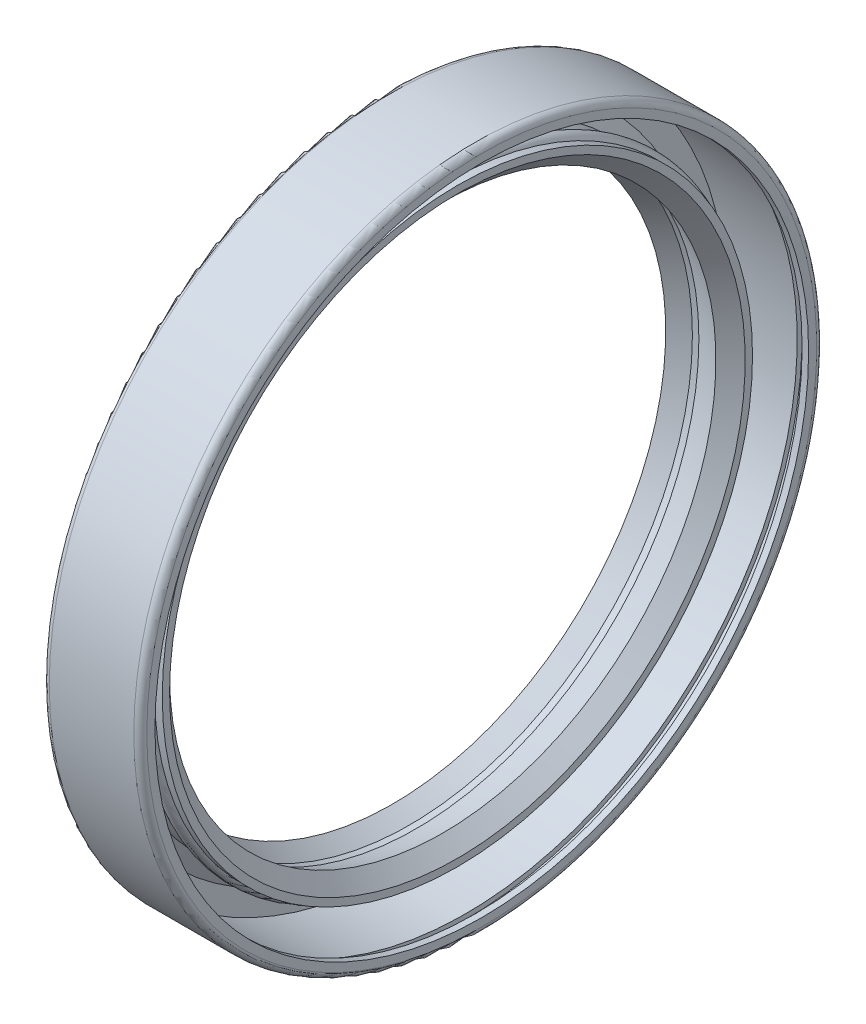
ISO-10303-21;
HEADER;
FILE_DESCRIPTION(('STEP AP214'),'2;1');
FILE_NAME('part.step','',(''),(''),'','','');
FILE_SCHEMA(('AUTOMOTIVE_DESIGN { 1 0 10303 214 1 1 1 1 }'));
ENDSEC;
DATA;
#1=APPLICATION_CONTEXT('core data for automotive mechanical design processes');
#2=APPLICATION_PROTOCOL_DEFINITION('international standard','automotive_design',2000,#1);
#3=PRODUCT_CONTEXT('',#1,'mechanical');
#4=PRODUCT('Part','Part','',(#3));
#5=PRODUCT_RELATED_PRODUCT_CATEGORY('part','',(#4));
#6=PRODUCT_DEFINITION_FORMATION('','',#4);
#7=PRODUCT_DEFINITION_CONTEXT('part definition',#1,'design');
#8=PRODUCT_DEFINITION('design','',#6,#7);
#9=PRODUCT_DEFINITION_SHAPE('','',#8);
#10=(LENGTH_UNIT() NAMED_UNIT(*) SI_UNIT(.MILLI.,.METRE.));
#11=(NAMED_UNIT(*) PLANE_ANGLE_UNIT() SI_UNIT($,.RADIAN.));
#12=(NAMED_UNIT(*) SI_UNIT($,.STERADIAN.) SOLID_ANGLE_UNIT());
#13=UNCERTAINTY_MEASURE_WITH_UNIT(LENGTH_MEASURE(1.E-05),#10,'distance_accuracy_value','');
#14=(GEOMETRIC_REPRESENTATION_CONTEXT(3) GLOBAL_UNCERTAINTY_ASSIGNED_CONTEXT((#13)) GLOBAL_UNIT_ASSIGNED_CONTEXT((#10,
#11,#12)) REPRESENTATION_CONTEXT('',''));
#15=CARTESIAN_POINT('',(0.,0.,0.));
#16=DIRECTION('',(0.,0.,1.));
#17=DIRECTION('',(1.,0.,0.));
#18=AXIS2_PLACEMENT_3D('',#15,#16,#17);
#19=CARTESIAN_POINT('',(0.,0.,0.));
#20=DIRECTION('',(-1.,0.,0.));
#21=DIRECTION('',(0.,0.,1.));
#22=AXIS2_PLACEMENT_3D('',#19,#20,#21);
#23=CONICAL_SURFACE('',#22,15.6830127018922,1.04719755119659);
#24=CARTESIAN_POINT('',(0.250000000000002,0.,0.));
#25=DIRECTION('',(-1.,0.,0.));
#26=DIRECTION('',(0.,0.,1.));
#27=AXIS2_PLACEMENT_3D('',#24,#25,#26);
#28=CIRCLE('',#27,15.25);
#29=CARTESIAN_POINT('',(0.250000000000002,0.,15.25));
#30=VERTEX_POINT('',#29);
#31=EDGE_CURVE('E10',#30,#30,#28,.T.);
#32=ORIENTED_EDGE('',*,*,#31,.F.);
#33=EDGE_LOOP('',(#32));
#34=FACE_BOUND('',#33,.T.);
#35=CARTESIAN_POINT('',(0.,0.,0.));
#36=DIRECTION('',(-1.,0.,0.));
#37=DIRECTION('',(0.,0.,1.));
#38=AXIS2_PLACEMENT_3D('',#35,#36,#37);
#39=CIRCLE('',#38,15.6830127018922);
#40=CARTESIAN_POINT('',(0.,0.,15.6830127018922));
#41=VERTEX_POINT('',#40);
#42=EDGE_CURVE('E117',#41,#41,#39,.T.);
#43=ORIENTED_EDGE('',*,*,#42,.T.);
#44=EDGE_LOOP('',(#43));
#45=FACE_BOUND('',#44,.T.);
#46=ADVANCED_FACE('F32',(#34,#45),#23,.F.);
#47=CARTESIAN_POINT('',(0.,0.,0.));
#48=DIRECTION('',(-1.,0.,0.));
#49=DIRECTION('',(0.,0.,1.));
#50=AXIS2_PLACEMENT_3D('',#47,#48,#49);
#51=CYLINDRICAL_SURFACE('',#50,15.25);
#52=CARTESIAN_POINT('',(0.,0.,0.));
#53=DIRECTION('',(-1.,0.,0.));
#54=DIRECTION('',(0.,0.,1.));
#55=AXIS2_PLACEMENT_3D('',#52,#53,#54);
#56=CIRCLE('',#55,15.25);
#57=CARTESIAN_POINT('',(0.,0.,15.25));
#58=VERTEX_POINT('',#57);
#59=EDGE_CURVE('E38',#58,#58,#56,.T.);
#60=ORIENTED_EDGE('',*,*,#59,.F.);
#61=EDGE_LOOP('',(#60));
#62=FACE_BOUND('',#61,.T.);
#63=ORIENTED_EDGE('',*,*,#31,.T.);
#64=EDGE_LOOP('',(#63));
#65=FACE_BOUND('',#64,.T.);
#66=ADVANCED_FACE('F268',(#62,#65),#51,.T.);
#67=CARTESIAN_POINT('',(0.,0.,-15.25));
#68=DIRECTION('',(1.,0.,0.));
#69=DIRECTION('',(0.,0.,-1.));
#70=AXIS2_PLACEMENT_3D('',#67,#68,#69);
#71=PLANE('',#70);
#72=CARTESIAN_POINT('',(0.,0.,0.));
#73=DIRECTION('',(-1.,0.,0.));
#74=DIRECTION('',(0.,0.,1.));
#75=AXIS2_PLACEMENT_3D('',#72,#73,#74);
#76=CIRCLE('',#75,14.8333333333333);
#77=CARTESIAN_POINT('',(0.,0.,14.8333333333333));
#78=VERTEX_POINT('',#77);
#79=EDGE_CURVE('E42',#78,#78,#76,.T.);
#80=ORIENTED_EDGE('',*,*,#79,.F.);
#81=EDGE_LOOP('',(#80));
#82=FACE_BOUND('',#81,.T.);
#83=ORIENTED_EDGE('',*,*,#59,.T.);
#84=EDGE_LOOP('',(#83));
#85=FACE_BOUND('',#84,.T.);
#86=ADVANCED_FACE('F263',(#82,#85),#71,.F.);
#87=CARTESIAN_POINT('',(0.333333333333335,0.,0.));
#88=DIRECTION('',(-1.,0.,0.));
#89=DIRECTION('',(0.,0.,1.));
#90=AXIS2_PLACEMENT_3D('',#87,#88,#89);
#91=TOROIDAL_SURFACE('',#90,14.8333333333333,0.333333333333333);
#92=CARTESIAN_POINT('',(0.333333333333335,0.,0.));
#93=DIRECTION('',(-1.,0.,0.));
#94=DIRECTION('',(0.,0.,1.));
#95=AXIS2_PLACEMENT_3D('',#92,#93,#94);
#96=CIRCLE('',#95,14.5);
#97=CARTESIAN_POINT('',(0.333333333333335,0.,14.5));
#98=VERTEX_POINT('',#97);
#99=EDGE_CURVE('E46',#98,#98,#96,.T.);
#100=ORIENTED_EDGE('',*,*,#99,.F.);
#101=EDGE_LOOP('',(#100));
#102=FACE_BOUND('',#101,.T.);
#103=ORIENTED_EDGE('',*,*,#79,.T.);
#104=EDGE_LOOP('',(#103));
#105=FACE_BOUND('',#104,.T.);
#106=ADVANCED_FACE('F257',(#102,#105),#91,.T.);
#107=CARTESIAN_POINT('',(0.,0.,0.));
#108=DIRECTION('',(-1.,0.,0.));
#109=DIRECTION('',(0.,0.,1.));
#110=AXIS2_PLACEMENT_3D('',#107,#108,#109);
#111=CYLINDRICAL_SURFACE('',#110,14.5);
#112=CARTESIAN_POINT('',(0.583333333333335,0.,0.));
#113=DIRECTION('',(-1.,0.,0.));
#114=DIRECTION('',(0.,0.,1.));
#115=AXIS2_PLACEMENT_3D('',#112,#113,#114);
#116=CIRCLE('',#115,14.5);
#117=CARTESIAN_POINT('',(0.583333333333335,0.,14.5));
#118=VERTEX_POINT('',#117);
#119=EDGE_CURVE('E51',#118,#118,#116,.T.);
#120=ORIENTED_EDGE('',*,*,#119,.F.);
#121=EDGE_LOOP('',(#120));
#122=FACE_BOUND('',#121,.T.);
#123=ORIENTED_EDGE('',*,*,#99,.T.);
#124=EDGE_LOOP('',(#123));
#125=FACE_BOUND('',#124,.T.);
#126=ADVANCED_FACE('F251',(#122,#125),#111,.F.);
#127=CARTESIAN_POINT('',(0.583333333333335,0.,0.));
#128=DIRECTION('',(1.,0.,0.));
#129=DIRECTION('',(0.,0.,-1.));
#130=AXIS2_PLACEMENT_3D('',#127,#128,#129);
#131=CONICAL_SURFACE('',#130,14.5,0.523598775598295);
#132=CARTESIAN_POINT('',(0.250000000000002,0.,0.));
#133=DIRECTION('',(-1.,0.,0.));
#134=DIRECTION('',(0.,0.,1.));
#135=AXIS2_PLACEMENT_3D('',#132,#133,#134);
#136=CIRCLE('',#135,14.3075499102701);
#137=CARTESIAN_POINT('',(0.250000000000002,0.,14.3075499102701));
#138=VERTEX_POINT('',#137);
#139=EDGE_CURVE('E54',#138,#138,#136,.T.);
#140=ORIENTED_EDGE('',*,*,#139,.F.);
#141=EDGE_LOOP('',(#140));
#142=FACE_BOUND('',#141,.T.);
#143=ORIENTED_EDGE('',*,*,#119,.T.);
#144=EDGE_LOOP('',(#143));
#145=FACE_BOUND('',#144,.T.);
#146=ADVANCED_FACE('F245',(#142,#145),#131,.T.);
#147=CARTESIAN_POINT('',(0.250000000000002,0.,0.));
#148=DIRECTION('',(-1.,0.,0.));
#149=DIRECTION('',(0.,0.,1.));
#150=AXIS2_PLACEMENT_3D('',#147,#148,#149);
#151=CONICAL_SURFACE('',#150,14.3075499102701,1.0471975511966);
#152=CARTESIAN_POINT('',(0.427564023483705,0.,0.));
#153=DIRECTION('',(-1.,0.,0.));
#154=DIRECTION('',(0.,0.,1.));
#155=AXIS2_PLACEMENT_3D('',#152,#153,#154);
#156=CIRCLE('',#155,14.);
#157=CARTESIAN_POINT('',(0.427564023483705,0.,14.));
#158=VERTEX_POINT('',#157);
#159=EDGE_CURVE('E57',#158,#158,#156,.T.);
#160=ORIENTED_EDGE('',*,*,#159,.F.);
#161=EDGE_LOOP('',(#160));
#162=FACE_BOUND('',#161,.T.);
#163=ORIENTED_EDGE('',*,*,#139,.T.);
#164=EDGE_LOOP('',(#163));
#165=FACE_BOUND('',#164,.T.);
#166=ADVANCED_FACE('F239',(#162,#165),#151,.F.);
#167=CARTESIAN_POINT('',(0.427564023483705,0.,0.));
#168=DIRECTION('',(1.,0.,0.));
#169=DIRECTION('',(0.,0.,-1.));
#170=AXIS2_PLACEMENT_3D('',#167,#168,#169);
#171=CONICAL_SURFACE('',#170,14.,0.523598775598299);
#172=CARTESIAN_POINT('',(1.29358942726814,0.,0.));
#173=DIRECTION('',(-1.,0.,0.));
#174=DIRECTION('',(0.,0.,1.));
#175=AXIS2_PLACEMENT_3D('',#172,#173,#174);
#176=CIRCLE('',#175,14.5);
#177=CARTESIAN_POINT('',(1.29358942726814,0.,14.5));
#178=VERTEX_POINT('',#177);
#179=EDGE_CURVE('E60',#178,#178,#176,.T.);
#180=ORIENTED_EDGE('',*,*,#179,.F.);
#181=EDGE_LOOP('',(#180));
#182=FACE_BOUND('',#181,.T.);
#183=ORIENTED_EDGE('',*,*,#159,.T.);
#184=EDGE_LOOP('',(#183));
#185=FACE_BOUND('',#184,.T.);
#186=ADVANCED_FACE('F233',(#182,#185),#171,.F.);
#187=CARTESIAN_POINT('',(0.,0.,0.));
#188=DIRECTION('',(-1.,0.,0.));
#189=DIRECTION('',(0.,0.,1.));
#190=AXIS2_PLACEMENT_3D('',#187,#188,#189);
#191=CYLINDRICAL_SURFACE('',#190,14.5);
#192=CARTESIAN_POINT('',(1.6262612902727,0.,0.));
#193=DIRECTION('',(-1.,0.,0.));
#194=DIRECTION('',(0.,0.,1.));
#195=AXIS2_PLACEMENT_3D('',#192,#193,#194);
#196=CIRCLE('',#195,14.5);
#197=CARTESIAN_POINT('',(1.6262612902727,0.,14.5));
#198=VERTEX_POINT('',#197);
#199=EDGE_CURVE('E63',#198,#198,#196,.T.);
#200=ORIENTED_EDGE('',*,*,#199,.F.);
#201=EDGE_LOOP('',(#200));
#202=FACE_BOUND('',#201,.T.);
#203=ORIENTED_EDGE('',*,*,#179,.T.);
#204=EDGE_LOOP('',(#203));
#205=FACE_BOUND('',#204,.T.);
#206=ADVANCED_FACE('F227',(#202,#205),#191,.F.);
#207=CARTESIAN_POINT('',(1.6262612902727,0.,0.));
#208=DIRECTION('',(-1.,0.,0.));
#209=DIRECTION('',(0.,0.,1.));
#210=AXIS2_PLACEMENT_3D('',#207,#208,#209);
#211=CONICAL_SURFACE('',#210,14.5,0.349065850398867);
#212=CARTESIAN_POINT('',(3.,0.,0.));
#213=DIRECTION('',(-1.,0.,0.));
#214=DIRECTION('',(0.,0.,1.));
#215=AXIS2_PLACEMENT_3D('',#212,#213,#214);
#216=CIRCLE('',#215,14.);
#217=CARTESIAN_POINT('',(3.,0.,14.));
#218=VERTEX_POINT('',#217);
#219=EDGE_CURVE('E66',#218,#218,#216,.T.);
#220=ORIENTED_EDGE('',*,*,#219,.F.);
#221=EDGE_LOOP('',(#220));
#222=FACE_BOUND('',#221,.T.);
#223=ORIENTED_EDGE('',*,*,#199,.T.);
#224=EDGE_LOOP('',(#223));
#225=FACE_BOUND('',#224,.T.);
#226=ADVANCED_FACE('F221',(#222,#225),#211,.F.);
#227=CARTESIAN_POINT('',(3.,0.,0.));
#228=DIRECTION('',(1.,0.,0.));
#229=DIRECTION('',(0.,0.,-1.));
#230=AXIS2_PLACEMENT_3D('',#227,#228,#229);
#231=CONICAL_SURFACE('',#230,14.,0.78539816339745);
#232=CARTESIAN_POINT('',(3.75,0.,0.));
#233=DIRECTION('',(-1.,0.,0.));
#234=DIRECTION('',(0.,0.,1.));
#235=AXIS2_PLACEMENT_3D('',#232,#233,#234);
#236=CIRCLE('',#235,14.75);
#237=CARTESIAN_POINT('',(3.75,0.,14.75));
#238=VERTEX_POINT('',#237);
#239=EDGE_CURVE('E69',#238,#238,#236,.T.);
#240=ORIENTED_EDGE('',*,*,#239,.F.);
#241=EDGE_LOOP('',(#240));
#242=FACE_BOUND('',#241,.T.);
#243=ORIENTED_EDGE('',*,*,#219,.T.);
#244=EDGE_LOOP('',(#243));
#245=FACE_BOUND('',#244,.T.);
#246=ADVANCED_FACE('F215',(#242,#245),#231,.F.);
#247=CARTESIAN_POINT('',(3.75,0.,-14.75));
#248=DIRECTION('',(-1.,0.,0.));
#249=DIRECTION('',(0.,0.,1.));
#250=AXIS2_PLACEMENT_3D('',#247,#248,#249);
#251=PLANE('',#250);
#252=CARTESIAN_POINT('',(3.75,0.,0.));
#253=DIRECTION('',(-1.,0.,0.));
#254=DIRECTION('',(0.,0.,1.));
#255=AXIS2_PLACEMENT_3D('',#252,#253,#254);
#256=CIRCLE('',#255,15.125);
#257=CARTESIAN_POINT('',(3.75,0.,15.125));
#258=VERTEX_POINT('',#257);
#259=EDGE_CURVE('E72',#258,#258,#256,.T.);
#260=ORIENTED_EDGE('',*,*,#259,.F.);
#261=EDGE_LOOP('',(#260));
#262=FACE_BOUND('',#261,.T.);
#263=ORIENTED_EDGE('',*,*,#239,.T.);
#264=EDGE_LOOP('',(#263));
#265=FACE_BOUND('',#264,.T.);
#266=ADVANCED_FACE('F209',(#262,#265),#251,.F.);
#267=CARTESIAN_POINT('',(0.,0.,0.));
#268=DIRECTION('',(-1.,0.,0.));
#269=DIRECTION('',(0.,0.,1.));
#270=AXIS2_PLACEMENT_3D('',#267,#268,#269);
#271=CYLINDRICAL_SURFACE('',#270,15.125);
#272=CARTESIAN_POINT('',(3.35355339059328,0.,0.));
#273=DIRECTION('',(-1.,0.,0.));
#274=DIRECTION('',(0.,0.,1.));
#275=AXIS2_PLACEMENT_3D('',#272,#273,#274);
#276=CIRCLE('',#275,15.125);
#277=CARTESIAN_POINT('',(3.35355339059328,0.,15.125));
#278=VERTEX_POINT('',#277);
#279=EDGE_CURVE('E75',#278,#278,#276,.T.);
#280=ORIENTED_EDGE('',*,*,#279,.F.);
#281=EDGE_LOOP('',(#280));
#282=FACE_BOUND('',#281,.T.);
#283=ORIENTED_EDGE('',*,*,#259,.T.);
#284=EDGE_LOOP('',(#283));
#285=FACE_BOUND('',#284,.T.);
#286=ADVANCED_FACE('F203',(#282,#285),#271,.T.);
#287=CARTESIAN_POINT('',(3.,0.,0.));
#288=DIRECTION('',(-1.,0.,0.));
#289=DIRECTION('',(0.,0.,1.));
#290=AXIS2_PLACEMENT_3D('',#287,#288,#289);
#291=TOROIDAL_SURFACE('',#290,15.,0.375);
#292=CARTESIAN_POINT('',(2.625,0.,0.));
#293=DIRECTION('',(-1.,0.,0.));
#294=DIRECTION('',(0.,0.,1.));
#295=AXIS2_PLACEMENT_3D('',#292,#293,#294);
#296=CIRCLE('',#295,15.);
#297=CARTESIAN_POINT('',(2.625,0.,15.));
#298=VERTEX_POINT('',#297);
#299=EDGE_CURVE('E78',#298,#298,#296,.T.);
#300=ORIENTED_EDGE('',*,*,#299,.F.);
#301=EDGE_LOOP('',(#300));
#302=FACE_BOUND('',#301,.T.);
#303=ORIENTED_EDGE('',*,*,#279,.T.);
#304=EDGE_LOOP('',(#303));
#305=FACE_BOUND('',#304,.T.);
#306=ADVANCED_FACE('F197',(#302,#305),#291,.T.);
#307=CARTESIAN_POINT('',(0.,0.,0.));
#308=DIRECTION('',(-1.,0.,0.));
#309=DIRECTION('',(0.,0.,1.));
#310=AXIS2_PLACEMENT_3D('',#307,#308,#309);
#311=CYLINDRICAL_SURFACE('',#310,15.);
#312=CARTESIAN_POINT('',(0.971687836487038,0.,0.));
#313=DIRECTION('',(-1.,0.,0.));
#314=DIRECTION('',(0.,0.,1.));
#315=AXIS2_PLACEMENT_3D('',#312,#313,#314);
#316=CIRCLE('',#315,15.);
#317=CARTESIAN_POINT('',(0.971687836487038,0.,15.));
#318=VERTEX_POINT('',#317);
#319=EDGE_CURVE('E81',#318,#318,#316,.T.);
#320=ORIENTED_EDGE('',*,*,#319,.F.);
#321=EDGE_LOOP('',(#320));
#322=FACE_BOUND('',#321,.T.);
#323=ORIENTED_EDGE('',*,*,#299,.T.);
#324=EDGE_LOOP('',(#323));
#325=FACE_BOUND('',#324,.T.);
#326=ADVANCED_FACE('F191',(#322,#325),#311,.T.);
#327=CARTESIAN_POINT('',(0.971687836487038,0.,0.));
#328=DIRECTION('',(-1.,0.,0.));
#329=DIRECTION('',(0.,0.,1.));
#330=AXIS2_PLACEMENT_3D('',#327,#328,#329);
#331=CONICAL_SURFACE('',#330,15.,1.04719755119659);
#332=CARTESIAN_POINT('',(0.500000000000003,0.,0.));
#333=DIRECTION('',(-1.,0.,0.));
#334=DIRECTION('',(0.,0.,1.));
#335=AXIS2_PLACEMENT_3D('',#332,#333,#334);
#336=CIRCLE('',#335,15.8169872981078);
#337=CARTESIAN_POINT('',(0.500000000000003,0.,15.8169872981078));
#338=VERTEX_POINT('',#337);
#339=EDGE_CURVE('E84',#338,#338,#336,.T.);
#340=ORIENTED_EDGE('',*,*,#339,.F.);
#341=EDGE_LOOP('',(#340));
#342=FACE_BOUND('',#341,.T.);
#343=ORIENTED_EDGE('',*,*,#319,.T.);
#344=EDGE_LOOP('',(#343));
#345=FACE_BOUND('',#344,.T.);
#346=ADVANCED_FACE('F185',(#342,#345),#331,.T.);
#347=CARTESIAN_POINT('',(0.500000000000003,0.,-17.));
#348=DIRECTION('',(-1.,0.,0.));
#349=DIRECTION('',(0.,0.,1.));
#350=AXIS2_PLACEMENT_3D('',#347,#348,#349);
#351=PLANE('',#350);
#352=CARTESIAN_POINT('',(0.500000000000002,0.,0.));
#353=DIRECTION('',(-1.,0.,0.));
#354=DIRECTION('',(0.,0.,1.));
#355=AXIS2_PLACEMENT_3D('',#352,#353,#354);
#356=CIRCLE('',#355,17.);
#357=CARTESIAN_POINT('',(0.500000000000002,0.,17.));
#358=VERTEX_POINT('',#357);
#359=EDGE_CURVE('E87',#358,#358,#356,.T.);
#360=ORIENTED_EDGE('',*,*,#359,.F.);
#361=EDGE_LOOP('',(#360));
#362=FACE_BOUND('',#361,.T.);
#363=ORIENTED_EDGE('',*,*,#339,.T.);
#364=EDGE_LOOP('',(#363));
#365=FACE_BOUND('',#364,.T.);
#366=ADVANCED_FACE('F179',(#362,#365),#351,.F.);
#367=CARTESIAN_POINT('',(0.,0.,0.));
#368=DIRECTION('',(-1.,0.,0.));
#369=DIRECTION('',(0.,0.,1.));
#370=AXIS2_PLACEMENT_3D('',#367,#368,#369);
#371=CYLINDRICAL_SURFACE('',#370,17.);
#372=CARTESIAN_POINT('',(4.16666666666667,0.,0.));
#373=DIRECTION('',(-1.,0.,0.));
#374=DIRECTION('',(0.,0.,1.));
#375=AXIS2_PLACEMENT_3D('',#372,#373,#374);
#376=CIRCLE('',#375,17.);
#377=CARTESIAN_POINT('',(4.16666666666667,0.,17.));
#378=VERTEX_POINT('',#377);
#379=EDGE_CURVE('E90',#378,#378,#376,.T.);
#380=ORIENTED_EDGE('',*,*,#379,.F.);
#381=EDGE_LOOP('',(#380));
#382=FACE_BOUND('',#381,.T.);
#383=ORIENTED_EDGE('',*,*,#359,.T.);
#384=EDGE_LOOP('',(#383));
#385=FACE_BOUND('',#384,.T.);
#386=ADVANCED_FACE('F173',(#382,#385),#371,.F.);
#387=CARTESIAN_POINT('',(4.16666666666667,0.,-17.));
#388=DIRECTION('',(-1.,0.,0.));
#389=DIRECTION('',(0.,0.,1.));
#390=AXIS2_PLACEMENT_3D('',#387,#388,#389);
#391=PLANE('',#390);
#392=CARTESIAN_POINT('',(4.16666666666667,0.,0.));
#393=DIRECTION('',(-1.,0.,0.));
#394=DIRECTION('',(0.,0.,1.));
#395=AXIS2_PLACEMENT_3D('',#392,#393,#394);
#396=CIRCLE('',#395,17.25);
#397=CARTESIAN_POINT('',(4.16666666666667,0.,17.25));
#398=VERTEX_POINT('',#397);
#399=EDGE_CURVE('E93',#398,#398,#396,.T.);
#400=ORIENTED_EDGE('',*,*,#399,.F.);
#401=EDGE_LOOP('',(#400));
#402=FACE_BOUND('',#401,.T.);
#403=ORIENTED_EDGE('',*,*,#379,.T.);
#404=EDGE_LOOP('',(#403));
#405=FACE_BOUND('',#404,.T.);
#406=ADVANCED_FACE('F167',(#402,#405),#391,.F.);
#407=CARTESIAN_POINT('',(0.,0.,0.));
#408=DIRECTION('',(-1.,0.,0.));
#409=DIRECTION('',(0.,0.,1.));
#410=AXIS2_PLACEMENT_3D('',#407,#408,#409);
#411=CYLINDRICAL_SURFACE('',#410,17.25);
#412=CARTESIAN_POINT('',(4.66666666666667,0.,0.));
#413=DIRECTION('',(-1.,0.,0.));
#414=DIRECTION('',(0.,0.,1.));
#415=AXIS2_PLACEMENT_3D('',#412,#413,#414);
#416=CIRCLE('',#415,17.25);
#417=CARTESIAN_POINT('',(4.66666666666667,0.,17.25));
#418=VERTEX_POINT('',#417);
#419=EDGE_CURVE('E96',#418,#418,#416,.T.);
#420=ORIENTED_EDGE('',*,*,#419,.F.);
#421=EDGE_LOOP('',(#420));
#422=FACE_BOUND('',#421,.T.);
#423=ORIENTED_EDGE('',*,*,#399,.T.);
#424=EDGE_LOOP('',(#423));
#425=FACE_BOUND('',#424,.T.);
#426=ADVANCED_FACE('F161',(#422,#425),#411,.F.);
#427=CARTESIAN_POINT('',(4.66666666666667,0.,-17.25));
#428=DIRECTION('',(1.,0.,0.));
#429=DIRECTION('',(0.,0.,-1.));
#430=AXIS2_PLACEMENT_3D('',#427,#428,#429);
#431=PLANE('',#430);
#432=CARTESIAN_POINT('',(4.66666666666667,0.,0.));
#433=DIRECTION('',(-1.,0.,0.));
#434=DIRECTION('',(0.,0.,1.));
#435=AXIS2_PLACEMENT_3D('',#432,#433,#434);
#436=CIRCLE('',#435,16.75);
#437=CARTESIAN_POINT('',(4.66666666666667,0.,16.75));
#438=VERTEX_POINT('',#437);
#439=EDGE_CURVE('E99',#438,#438,#436,.T.);
#440=ORIENTED_EDGE('',*,*,#439,.F.);
#441=EDGE_LOOP('',(#440));
#442=FACE_BOUND('',#441,.T.);
#443=ORIENTED_EDGE('',*,*,#419,.T.);
#444=EDGE_LOOP('',(#443));
#445=FACE_BOUND('',#444,.T.);
#446=ADVANCED_FACE('F155',(#442,#445),#431,.F.);
#447=CARTESIAN_POINT('',(0.,0.,0.));
#448=DIRECTION('',(-1.,0.,0.));
#449=DIRECTION('',(0.,0.,1.));
#450=AXIS2_PLACEMENT_3D('',#447,#448,#449);
#451=CYLINDRICAL_SURFACE('',#450,16.75);
#452=CARTESIAN_POINT('',(5.,0.,0.));
#453=DIRECTION('',(-1.,0.,0.));
#454=DIRECTION('',(0.,0.,1.));
#455=AXIS2_PLACEMENT_3D('',#452,#453,#454);
#456=CIRCLE('',#455,16.75);
#457=CARTESIAN_POINT('',(5.,0.,16.75));
#458=VERTEX_POINT('',#457);
#459=EDGE_CURVE('E102',#458,#458,#456,.T.);
#460=ORIENTED_EDGE('',*,*,#459,.F.);
#461=EDGE_LOOP('',(#460));
#462=FACE_BOUND('',#461,.T.);
#463=ORIENTED_EDGE('',*,*,#439,.T.);
#464=EDGE_LOOP('',(#463));
#465=FACE_BOUND('',#464,.T.);
#466=ADVANCED_FACE('F149',(#462,#465),#451,.F.);
#467=CARTESIAN_POINT('',(5.,0.,-16.75));
#468=DIRECTION('',(-1.,0.,0.));
#469=DIRECTION('',(0.,0.,1.));
#470=AXIS2_PLACEMENT_3D('',#467,#468,#469);
#471=PLANE('',#470);
#472=CARTESIAN_POINT('',(5.,0.,0.));
#473=DIRECTION('',(-1.,0.,0.));
#474=DIRECTION('',(0.,0.,1.));
#475=AXIS2_PLACEMENT_3D('',#472,#473,#474);
#476=CIRCLE('',#475,17.1666666666667);
#477=CARTESIAN_POINT('',(5.,0.,17.1666666666667));
#478=VERTEX_POINT('',#477);
#479=EDGE_CURVE('E105',#478,#478,#476,.T.);
#480=ORIENTED_EDGE('',*,*,#479,.F.);
#481=EDGE_LOOP('',(#480));
#482=FACE_BOUND('',#481,.T.);
#483=ORIENTED_EDGE('',*,*,#459,.T.);
#484=EDGE_LOOP('',(#483));
#485=FACE_BOUND('',#484,.T.);
#486=ADVANCED_FACE('F143',(#482,#485),#471,.F.);
#487=CARTESIAN_POINT('',(4.66666666666667,0.,0.));
#488=DIRECTION('',(-1.,0.,0.));
#489=DIRECTION('',(0.,0.,1.));
#490=AXIS2_PLACEMENT_3D('',#487,#488,#489);
#491=TOROIDAL_SURFACE('',#490,17.1666666666667,0.333333333333334);
#492=CARTESIAN_POINT('',(4.66666666666667,0.,0.));
#493=DIRECTION('',(-1.,0.,0.));
#494=DIRECTION('',(0.,0.,1.));
#495=AXIS2_PLACEMENT_3D('',#492,#493,#494);
#496=CIRCLE('',#495,17.5);
#497=CARTESIAN_POINT('',(4.66666666666667,0.,17.5));
#498=VERTEX_POINT('',#497);
#499=EDGE_CURVE('E108',#498,#498,#496,.T.);
#500=ORIENTED_EDGE('',*,*,#499,.F.);
#501=EDGE_LOOP('',(#500));
#502=FACE_BOUND('',#501,.T.);
#503=ORIENTED_EDGE('',*,*,#479,.T.);
#504=EDGE_LOOP('',(#503));
#505=FACE_BOUND('',#504,.T.);
#506=ADVANCED_FACE('F137',(#502,#505),#491,.T.);
#507=CARTESIAN_POINT('',(0.,0.,0.));
#508=DIRECTION('',(-1.,0.,0.));
#509=DIRECTION('',(0.,0.,1.));
#510=AXIS2_PLACEMENT_3D('',#507,#508,#509);
#511=CYLINDRICAL_SURFACE('',#510,17.5);
#512=CARTESIAN_POINT('',(0.333333333333333,0.,0.));
#513=DIRECTION('',(-1.,0.,0.));
#514=DIRECTION('',(0.,0.,1.));
#515=AXIS2_PLACEMENT_3D('',#512,#513,#514);
#516=CIRCLE('',#515,17.5);
#517=CARTESIAN_POINT('',(0.333333333333333,0.,17.5));
#518=VERTEX_POINT('',#517);
#519=EDGE_CURVE('E111',#518,#518,#516,.T.);
#520=ORIENTED_EDGE('',*,*,#519,.F.);
#521=EDGE_LOOP('',(#520));
#522=FACE_BOUND('',#521,.T.);
#523=ORIENTED_EDGE('',*,*,#499,.T.);
#524=EDGE_LOOP('',(#523));
#525=FACE_BOUND('',#524,.T.);
#526=ADVANCED_FACE('F131',(#522,#525),#511,.T.);
#527=CARTESIAN_POINT('',(0.333333333333333,0.,0.));
#528=DIRECTION('',(-1.,0.,0.));
#529=DIRECTION('',(0.,0.,1.));
#530=AXIS2_PLACEMENT_3D('',#527,#528,#529);
#531=TOROIDAL_SURFACE('',#530,17.1666666666667,0.333333333333334);
#532=CARTESIAN_POINT('',(0.,0.,0.));
#533=DIRECTION('',(-1.,0.,0.));
#534=DIRECTION('',(0.,0.,1.));
#535=AXIS2_PLACEMENT_3D('',#532,#533,#534);
#536=CIRCLE('',#535,17.1666666666667);
#537=CARTESIAN_POINT('',(0.,0.,17.1666666666667));
#538=VERTEX_POINT('',#537);
#539=EDGE_CURVE('E114',#538,#538,#536,.T.);
#540=ORIENTED_EDGE('',*,*,#539,.F.);
#541=EDGE_LOOP('',(#540));
#542=FACE_BOUND('',#541,.T.);
#543=ORIENTED_EDGE('',*,*,#519,.T.);
#544=EDGE_LOOP('',(#543));
#545=FACE_BOUND('',#544,.T.);
#546=ADVANCED_FACE('F125',(#542,#545),#531,.T.);
#547=CARTESIAN_POINT('',(0.,0.,-15.6830127018922));
#548=DIRECTION('',(1.,0.,0.));
#549=DIRECTION('',(0.,0.,-1.));
#550=AXIS2_PLACEMENT_3D('',#547,#548,#549);
#551=PLANE('',#550);
#552=ORIENTED_EDGE('',*,*,#42,.F.);
#553=EDGE_LOOP('',(#552));
#554=FACE_BOUND('',#553,.T.);
#555=ORIENTED_EDGE('',*,*,#539,.T.);
#556=EDGE_LOOP('',(#555));
#557=FACE_BOUND('',#556,.T.);
#558=ADVANCED_FACE('F122',(#554,#557),#551,.F.);
#559=CLOSED_SHELL('',(#46,#66,#86,#106,#126,#146,#166,#186,#206,#226,#246,#266,#286,#306,#326,
#346,#366,#386,#406,#426,#446,#466,#486,#506,#526,#546,#558));
#560=MANIFOLD_SOLID_BREP('B2',#559);
#561=ADVANCED_BREP_SHAPE_REPRESENTATION('',(#18,#560),#14);
#562=SHAPE_DEFINITION_REPRESENTATION(#9,#561);
ENDSEC;
END-ISO-10303-21;
